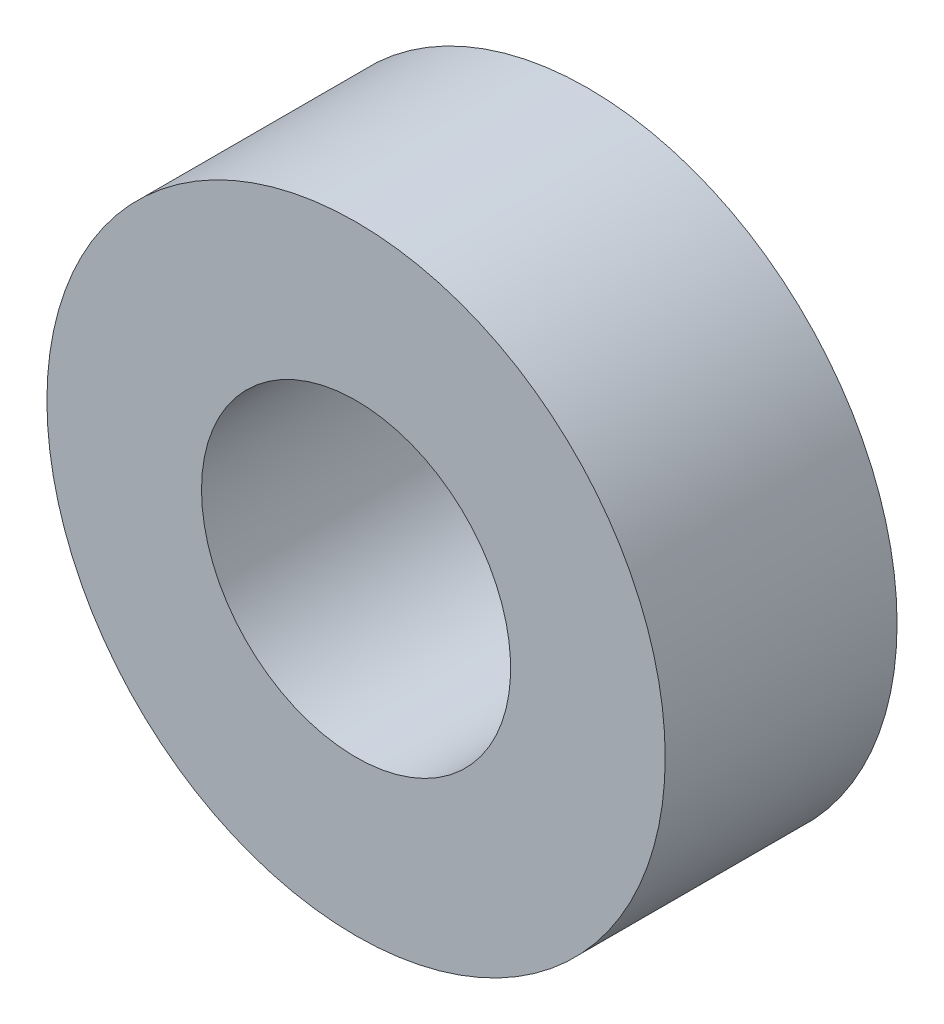
ISO-10303-21;
HEADER;
FILE_DESCRIPTION(('STEP AP214'),'2;1');
FILE_NAME('part.step','',(''),(''),'','','');
FILE_SCHEMA(('AUTOMOTIVE_DESIGN { 1 0 10303 214 1 1 1 1 }'));
ENDSEC;
DATA;
#1=APPLICATION_CONTEXT('core data for automotive mechanical design processes');
#2=APPLICATION_PROTOCOL_DEFINITION('international standard','automotive_design',2000,#1);
#3=PRODUCT_CONTEXT('',#1,'mechanical');
#4=PRODUCT('Part','Part','',(#3));
#5=PRODUCT_RELATED_PRODUCT_CATEGORY('part','',(#4));
#6=PRODUCT_DEFINITION_FORMATION('','',#4);
#7=PRODUCT_DEFINITION_CONTEXT('part definition',#1,'design');
#8=PRODUCT_DEFINITION('design','',#6,#7);
#9=PRODUCT_DEFINITION_SHAPE('','',#8);
#10=(LENGTH_UNIT() NAMED_UNIT(*) SI_UNIT(.MILLI.,.METRE.));
#11=(NAMED_UNIT(*) PLANE_ANGLE_UNIT() SI_UNIT($,.RADIAN.));
#12=(NAMED_UNIT(*) SI_UNIT($,.STERADIAN.) SOLID_ANGLE_UNIT());
#13=UNCERTAINTY_MEASURE_WITH_UNIT(LENGTH_MEASURE(1.E-05),#10,'distance_accuracy_value','');
#14=(GEOMETRIC_REPRESENTATION_CONTEXT(3) GLOBAL_UNCERTAINTY_ASSIGNED_CONTEXT((#13)) GLOBAL_UNIT_ASSIGNED_CONTEXT((#10,
#11,#12)) REPRESENTATION_CONTEXT('',''));
#15=CARTESIAN_POINT('',(0.,0.,0.));
#16=DIRECTION('',(0.,0.,1.));
#17=DIRECTION('',(1.,0.,0.));
#18=AXIS2_PLACEMENT_3D('',#15,#16,#17);
#19=CARTESIAN_POINT('',(0.,0.,4.7625));
#20=DIRECTION('',(0.,0.,-1.));
#21=DIRECTION('',(-1.,0.,0.));
#22=AXIS2_PLACEMENT_3D('',#19,#20,#21);
#23=CYLINDRICAL_SURFACE('',#22,6.35);
#24=CARTESIAN_POINT('',(0.,0.,4.7625));
#25=DIRECTION('',(0.,0.,1.));
#26=DIRECTION('',(1.,0.,0.));
#27=AXIS2_PLACEMENT_3D('',#24,#25,#26);
#28=CIRCLE('',#27,6.35);
#29=CARTESIAN_POINT('',(-6.35,0.,4.7625));
#30=VERTEX_POINT('',#29);
#31=EDGE_CURVE('E10',#30,#30,#28,.T.);
#32=CARTESIAN_POINT('',(0.,0.,0.));
#33=DIRECTION('',(0.,0.,1.));
#34=DIRECTION('',(1.,0.,0.));
#35=AXIS2_PLACEMENT_3D('',#32,#33,#34);
#36=CIRCLE('',#35,6.35);
#37=CARTESIAN_POINT('',(-6.35,0.,0.));
#38=VERTEX_POINT('',#37);
#39=EDGE_CURVE('E34',#38,#38,#36,.T.);
#40=CARTESIAN_POINT('',(-6.35,0.,4.7625));
#41=CARTESIAN_POINT('',(-6.35,0.,4.712890625));
#42=CARTESIAN_POINT('',(-6.35,0.,4.66328125));
#43=CARTESIAN_POINT('',(-6.35,0.,4.5640625));
#44=CARTESIAN_POINT('',(-6.35,0.,4.514453125));
#45=CARTESIAN_POINT('',(-6.35,0.,4.415234375));
#46=CARTESIAN_POINT('',(-6.35,0.,4.365625));
#47=CARTESIAN_POINT('',(-6.35,0.,4.26640625));
#48=CARTESIAN_POINT('',(-6.35,0.,4.216796875));
#49=CARTESIAN_POINT('',(-6.35,0.,4.117578125));
#50=CARTESIAN_POINT('',(-6.35,0.,4.06796875));
#51=CARTESIAN_POINT('',(-6.35,0.,3.96875));
#52=CARTESIAN_POINT('',(-6.35,0.,3.919140625));
#53=CARTESIAN_POINT('',(-6.35,0.,3.819921875));
#54=CARTESIAN_POINT('',(-6.35,0.,3.7703125));
#55=CARTESIAN_POINT('',(-6.35,0.,3.67109375));
#56=CARTESIAN_POINT('',(-6.35,0.,3.621484375));
#57=CARTESIAN_POINT('',(-6.35,0.,3.522265625));
#58=CARTESIAN_POINT('',(-6.35,0.,3.47265625));
#59=CARTESIAN_POINT('',(-6.35,0.,3.3734375));
#60=CARTESIAN_POINT('',(-6.35,0.,3.323828125));
#61=CARTESIAN_POINT('',(-6.35,0.,3.224609375));
#62=CARTESIAN_POINT('',(-6.35,0.,3.175));
#63=CARTESIAN_POINT('',(-6.35,0.,3.07578125));
#64=CARTESIAN_POINT('',(-6.35,0.,3.026171875));
#65=CARTESIAN_POINT('',(-6.35,0.,2.926953125));
#66=CARTESIAN_POINT('',(-6.35,0.,2.87734375));
#67=CARTESIAN_POINT('',(-6.35,0.,2.778125));
#68=CARTESIAN_POINT('',(-6.35,0.,2.728515625));
#69=CARTESIAN_POINT('',(-6.35,0.,2.629296875));
#70=CARTESIAN_POINT('',(-6.35,0.,2.5796875));
#71=CARTESIAN_POINT('',(-6.35,0.,2.48046875));
#72=CARTESIAN_POINT('',(-6.35,0.,2.430859375));
#73=CARTESIAN_POINT('',(-6.35,0.,2.331640625));
#74=CARTESIAN_POINT('',(-6.35,0.,2.28203125));
#75=CARTESIAN_POINT('',(-6.35,0.,2.1828125));
#76=CARTESIAN_POINT('',(-6.35,0.,2.133203125));
#77=CARTESIAN_POINT('',(-6.35,0.,2.033984375));
#78=CARTESIAN_POINT('',(-6.35,0.,1.984375));
#79=CARTESIAN_POINT('',(-6.35,0.,1.88515625));
#80=CARTESIAN_POINT('',(-6.35,0.,1.835546875));
#81=CARTESIAN_POINT('',(-6.35,0.,1.736328125));
#82=CARTESIAN_POINT('',(-6.35,0.,1.68671875));
#83=CARTESIAN_POINT('',(-6.35,0.,1.5875));
#84=CARTESIAN_POINT('',(-6.35,0.,1.537890625));
#85=CARTESIAN_POINT('',(-6.35,0.,1.438671875));
#86=CARTESIAN_POINT('',(-6.35,0.,1.3890625));
#87=CARTESIAN_POINT('',(-6.35,0.,1.28984375));
#88=CARTESIAN_POINT('',(-6.35,0.,1.240234375));
#89=CARTESIAN_POINT('',(-6.35,0.,1.141015625));
#90=CARTESIAN_POINT('',(-6.35,0.,1.09140625));
#91=CARTESIAN_POINT('',(-6.35,0.,0.992187499999999));
#92=CARTESIAN_POINT('',(-6.35,0.,0.942578124999999));
#93=CARTESIAN_POINT('',(-6.35,0.,0.843359375));
#94=CARTESIAN_POINT('',(-6.35,0.,0.79375));
#95=CARTESIAN_POINT('',(-6.35,0.,0.69453125));
#96=CARTESIAN_POINT('',(-6.35,0.,0.644921875));
#97=CARTESIAN_POINT('',(-6.35,0.,0.545703125));
#98=CARTESIAN_POINT('',(-6.35,0.,0.49609375));
#99=CARTESIAN_POINT('',(-6.35,0.,0.396875));
#100=CARTESIAN_POINT('',(-6.35,0.,0.347265625));
#101=CARTESIAN_POINT('',(-6.35,0.,0.248046875));
#102=CARTESIAN_POINT('',(-6.35,0.,0.1984375));
#103=CARTESIAN_POINT('',(-6.35,0.,0.09921875));
#104=CARTESIAN_POINT('',(-6.35,0.,0.049609375));
#105=CARTESIAN_POINT('',(-6.35,0.,0.));
#106=B_SPLINE_CURVE_WITH_KNOTS('',3,(#40,#41,#42,#43,#44,#45,#46,#47,#48,#49,#50,#51,#52,#53,
#54,#55,#56,#57,#58,#59,#60,#61,#62,#63,#64,#65,#66,#67,#68,#69,#70,#71,#72,#73,#74,#75,#76,#77,
#78,#79,#80,#81,#82,#83,#84,#85,#86,#87,#88,#89,#90,#91,#92,#93,#94,#95,#96,#97,#98,#99,#100,
#101,#102,#103,#104,#105),.UNSPECIFIED.,.F.,.F.,(4,2,2,2,2,2,2,2,2,2,2,2,2,2,2,2,2,2,2,2,2,2,2,
2,2,2,2,2,2,2,2,2,4),(0.,0.148828125,0.29765625,0.446484375,0.5953125,0.744140625,
0.892968750000001,1.041796875,1.190625,1.339453125,1.48828125,1.637109375,1.7859375,1.934765625,
2.08359375,2.232421875,2.38125,2.530078125,2.67890625,2.827734375,2.9765625,3.125390625,
3.27421875,3.423046875,3.571875,3.720703125,3.86953125,4.018359375,4.1671875,4.316015625,
4.46484375,4.613671875,4.7625),.UNSPECIFIED.);
#107=EDGE_CURVE('BSEAM31',#30,#38,#106,.T.);
#108=ORIENTED_EDGE('',*,*,#31,.F.);
#109=ORIENTED_EDGE('',*,*,#39,.T.);
#110=ORIENTED_EDGE('',*,*,#107,.T.);
#111=ORIENTED_EDGE('',*,*,#107,.F.);
#112=EDGE_LOOP('',(#108,#110,#109,#111));
#113=FACE_BOUND('',#112,.T.);
#114=ADVANCED_FACE('F31',(#113),#23,.T.);
#115=CARTESIAN_POINT('',(0.,0.,4.7625));
#116=DIRECTION('',(0.,0.,1.));
#117=DIRECTION('',(1.,0.,0.));
#118=AXIS2_PLACEMENT_3D('',#115,#116,#117);
#119=PLANE('',#118);
#120=CARTESIAN_POINT('',(0.,0.,4.7625));
#121=DIRECTION('',(0.,0.,-1.));
#122=DIRECTION('',(-1.,0.,0.));
#123=AXIS2_PLACEMENT_3D('',#120,#121,#122);
#124=CIRCLE('',#123,3.175);
#125=CARTESIAN_POINT('',(-3.175,0.,4.7625));
#126=VERTEX_POINT('',#125);
#127=EDGE_CURVE('E41',#126,#126,#124,.T.);
#128=ORIENTED_EDGE('',*,*,#127,.T.);
#129=EDGE_LOOP('',(#128));
#130=FACE_BOUND('',#129,.T.);
#131=ORIENTED_EDGE('',*,*,#31,.T.);
#132=EDGE_LOOP('',(#131));
#133=FACE_BOUND('',#132,.T.);
#134=ADVANCED_FACE('F49',(#130,#133),#119,.T.);
#135=CARTESIAN_POINT('',(0.,0.,0.));
#136=DIRECTION('',(0.,0.,1.));
#137=DIRECTION('',(1.,0.,0.));
#138=AXIS2_PLACEMENT_3D('',#135,#136,#137);
#139=PLANE('',#138);
#140=CARTESIAN_POINT('',(0.,0.,0.));
#141=DIRECTION('',(0.,0.,-1.));
#142=DIRECTION('',(-1.,0.,0.));
#143=AXIS2_PLACEMENT_3D('',#140,#141,#142);
#144=CIRCLE('',#143,3.175);
#145=CARTESIAN_POINT('',(-3.175,0.,0.));
#146=VERTEX_POINT('',#145);
#147=EDGE_CURVE('E43',#146,#146,#144,.T.);
#148=ORIENTED_EDGE('',*,*,#147,.F.);
#149=EDGE_LOOP('',(#148));
#150=FACE_BOUND('',#149,.T.);
#151=ORIENTED_EDGE('',*,*,#39,.F.);
#152=EDGE_LOOP('',(#151));
#153=FACE_BOUND('',#152,.T.);
#154=ADVANCED_FACE('F54',(#150,#153),#139,.F.);
#155=CARTESIAN_POINT('',(0.,0.,4.7625));
#156=DIRECTION('',(0.,0.,-1.));
#157=DIRECTION('',(-1.,0.,0.));
#158=AXIS2_PLACEMENT_3D('',#155,#156,#157);
#159=CYLINDRICAL_SURFACE('',#158,3.175);
#160=CARTESIAN_POINT('',(-3.175,0.,4.7625));
#161=CARTESIAN_POINT('',(-3.175,0.,4.712890625));
#162=CARTESIAN_POINT('',(-3.175,0.,4.66328125));
#163=CARTESIAN_POINT('',(-3.175,0.,4.5640625));
#164=CARTESIAN_POINT('',(-3.175,0.,4.514453125));
#165=CARTESIAN_POINT('',(-3.175,0.,4.415234375));
#166=CARTESIAN_POINT('',(-3.175,0.,4.365625));
#167=CARTESIAN_POINT('',(-3.175,0.,4.26640625));
#168=CARTESIAN_POINT('',(-3.175,0.,4.216796875));
#169=CARTESIAN_POINT('',(-3.175,0.,4.117578125));
#170=CARTESIAN_POINT('',(-3.175,0.,4.06796875));
#171=CARTESIAN_POINT('',(-3.175,0.,3.96875));
#172=CARTESIAN_POINT('',(-3.175,0.,3.919140625));
#173=CARTESIAN_POINT('',(-3.175,0.,3.819921875));
#174=CARTESIAN_POINT('',(-3.175,0.,3.7703125));
#175=CARTESIAN_POINT('',(-3.175,0.,3.67109375));
#176=CARTESIAN_POINT('',(-3.175,0.,3.621484375));
#177=CARTESIAN_POINT('',(-3.175,0.,3.522265625));
#178=CARTESIAN_POINT('',(-3.175,0.,3.47265625));
#179=CARTESIAN_POINT('',(-3.175,0.,3.3734375));
#180=CARTESIAN_POINT('',(-3.175,0.,3.323828125));
#181=CARTESIAN_POINT('',(-3.175,0.,3.224609375));
#182=CARTESIAN_POINT('',(-3.175,0.,3.175));
#183=CARTESIAN_POINT('',(-3.175,0.,3.07578125));
#184=CARTESIAN_POINT('',(-3.175,0.,3.026171875));
#185=CARTESIAN_POINT('',(-3.175,0.,2.926953125));
#186=CARTESIAN_POINT('',(-3.175,0.,2.87734375));
#187=CARTESIAN_POINT('',(-3.175,0.,2.778125));
#188=CARTESIAN_POINT('',(-3.175,0.,2.728515625));
#189=CARTESIAN_POINT('',(-3.175,0.,2.629296875));
#190=CARTESIAN_POINT('',(-3.175,0.,2.5796875));
#191=CARTESIAN_POINT('',(-3.175,0.,2.48046875));
#192=CARTESIAN_POINT('',(-3.175,0.,2.430859375));
#193=CARTESIAN_POINT('',(-3.175,0.,2.331640625));
#194=CARTESIAN_POINT('',(-3.175,0.,2.28203125));
#195=CARTESIAN_POINT('',(-3.175,0.,2.1828125));
#196=CARTESIAN_POINT('',(-3.175,0.,2.133203125));
#197=CARTESIAN_POINT('',(-3.175,0.,2.033984375));
#198=CARTESIAN_POINT('',(-3.175,0.,1.984375));
#199=CARTESIAN_POINT('',(-3.175,0.,1.88515625));
#200=CARTESIAN_POINT('',(-3.175,0.,1.835546875));
#201=CARTESIAN_POINT('',(-3.175,0.,1.736328125));
#202=CARTESIAN_POINT('',(-3.175,0.,1.68671875));
#203=CARTESIAN_POINT('',(-3.175,0.,1.5875));
#204=CARTESIAN_POINT('',(-3.175,0.,1.537890625));
#205=CARTESIAN_POINT('',(-3.175,0.,1.438671875));
#206=CARTESIAN_POINT('',(-3.175,0.,1.3890625));
#207=CARTESIAN_POINT('',(-3.175,0.,1.28984375));
#208=CARTESIAN_POINT('',(-3.175,0.,1.240234375));
#209=CARTESIAN_POINT('',(-3.175,0.,1.141015625));
#210=CARTESIAN_POINT('',(-3.175,0.,1.09140625));
#211=CARTESIAN_POINT('',(-3.175,0.,0.9921875));
#212=CARTESIAN_POINT('',(-3.175,0.,0.942578125));
#213=CARTESIAN_POINT('',(-3.175,0.,0.843359375));
#214=CARTESIAN_POINT('',(-3.175,0.,0.79375));
#215=CARTESIAN_POINT('',(-3.175,0.,0.69453125));
#216=CARTESIAN_POINT('',(-3.175,0.,0.644921875));
#217=CARTESIAN_POINT('',(-3.175,0.,0.545703125));
#218=CARTESIAN_POINT('',(-3.175,0.,0.49609375));
#219=CARTESIAN_POINT('',(-3.175,0.,0.396875));
#220=CARTESIAN_POINT('',(-3.175,0.,0.347265625));
#221=CARTESIAN_POINT('',(-3.175,0.,0.248046875));
#222=CARTESIAN_POINT('',(-3.175,0.,0.1984375));
#223=CARTESIAN_POINT('',(-3.175,0.,0.09921875));
#224=CARTESIAN_POINT('',(-3.175,0.,0.049609375));
#225=CARTESIAN_POINT('',(-3.175,0.,0.));
#226=B_SPLINE_CURVE_WITH_KNOTS('',3,(#160,#161,#162,#163,#164,#165,#166,#167,#168,#169,#170,
#171,#172,#173,#174,#175,#176,#177,#178,#179,#180,#181,#182,#183,#184,#185,#186,#187,#188,#189,
#190,#191,#192,#193,#194,#195,#196,#197,#198,#199,#200,#201,#202,#203,#204,#205,#206,#207,#208,
#209,#210,#211,#212,#213,#214,#215,#216,#217,#218,#219,#220,#221,#222,#223,#224,#225),
.UNSPECIFIED.,.F.,.F.,(4,2,2,2,2,2,2,2,2,2,2,2,2,2,2,2,2,2,2,2,2,2,2,2,2,2,2,2,2,2,2,2,4),(0.,
0.148828125,0.29765625,0.446484375,0.5953125,0.744140625,0.892968750000001,1.041796875,1.190625,
1.339453125,1.48828125,1.637109375,1.7859375,1.934765625,2.08359375,2.232421875,2.38125,
2.530078125,2.67890625,2.827734375,2.9765625,3.125390625,3.27421875,3.423046875,3.571875,
3.720703125,3.86953125,4.018359375,4.1671875,4.316015625,4.46484375,4.613671875,4.7625),.UNSPECIFIED.);
#227=EDGE_CURVE('BSEAM51',#126,#146,#226,.T.);
#228=ORIENTED_EDGE('',*,*,#127,.F.);
#229=ORIENTED_EDGE('',*,*,#147,.T.);
#230=ORIENTED_EDGE('',*,*,#227,.T.);
#231=ORIENTED_EDGE('',*,*,#227,.F.);
#232=EDGE_LOOP('',(#228,#230,#229,#231));
#233=FACE_BOUND('',#232,.T.);
#234=ADVANCED_FACE('F51',(#233),#159,.F.);
#235=CLOSED_SHELL('',(#114,#134,#154,#234));
#236=MANIFOLD_SOLID_BREP('B2',#235);
#237=ADVANCED_BREP_SHAPE_REPRESENTATION('',(#18,#236),#14);
#238=SHAPE_DEFINITION_REPRESENTATION(#9,#237);
ENDSEC;
END-ISO-10303-21;
